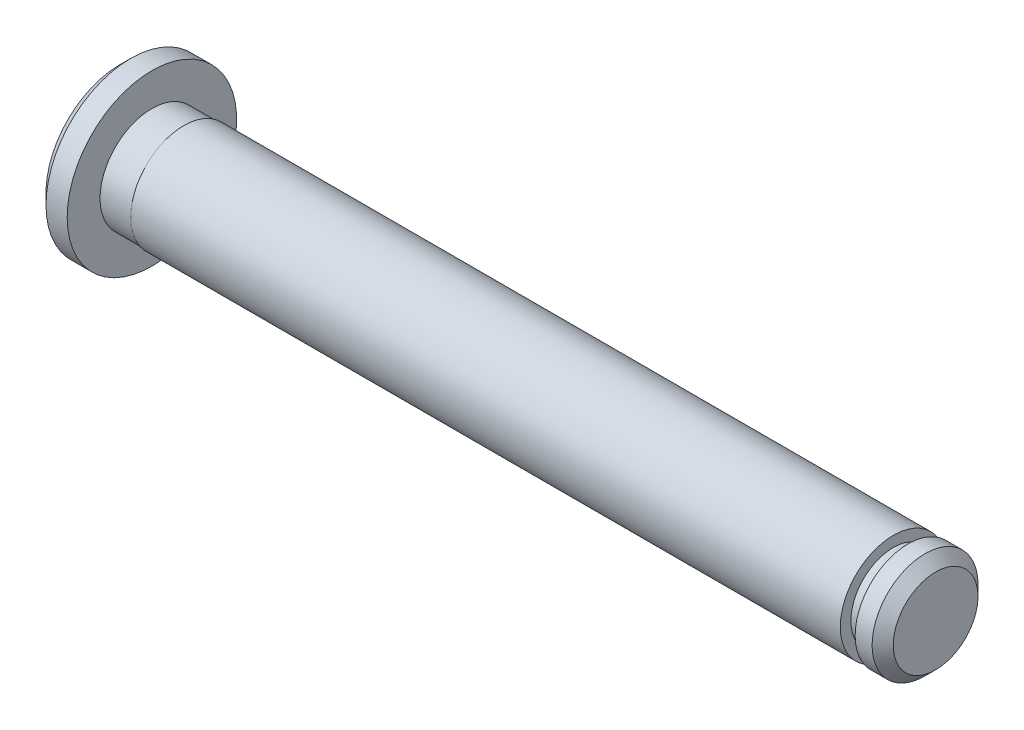
ISO-10303-21;
HEADER;
FILE_DESCRIPTION(('STEP AP214'),'2;1');
FILE_NAME('part.step','',(''),(''),'','','');
FILE_SCHEMA(('AUTOMOTIVE_DESIGN { 1 0 10303 214 1 1 1 1 }'));
ENDSEC;
DATA;
#1=APPLICATION_CONTEXT('core data for automotive mechanical design processes');
#2=APPLICATION_PROTOCOL_DEFINITION('international standard','automotive_design',2000,#1);
#3=PRODUCT_CONTEXT('',#1,'mechanical');
#4=PRODUCT('Part','Part','',(#3));
#5=PRODUCT_RELATED_PRODUCT_CATEGORY('part','',(#4));
#6=PRODUCT_DEFINITION_FORMATION('','',#4);
#7=PRODUCT_DEFINITION_CONTEXT('part definition',#1,'design');
#8=PRODUCT_DEFINITION('design','',#6,#7);
#9=PRODUCT_DEFINITION_SHAPE('','',#8);
#10=(LENGTH_UNIT() NAMED_UNIT(*) SI_UNIT(.MILLI.,.METRE.));
#11=(NAMED_UNIT(*) PLANE_ANGLE_UNIT() SI_UNIT($,.RADIAN.));
#12=(NAMED_UNIT(*) SI_UNIT($,.STERADIAN.) SOLID_ANGLE_UNIT());
#13=UNCERTAINTY_MEASURE_WITH_UNIT(LENGTH_MEASURE(1.E-05),#10,'distance_accuracy_value','');
#14=(GEOMETRIC_REPRESENTATION_CONTEXT(3) GLOBAL_UNCERTAINTY_ASSIGNED_CONTEXT((#13)) GLOBAL_UNIT_ASSIGNED_CONTEXT((#10,
#11,#12)) REPRESENTATION_CONTEXT('',''));
#15=CARTESIAN_POINT('',(0.,0.,0.));
#16=DIRECTION('',(0.,0.,1.));
#17=DIRECTION('',(1.,0.,0.));
#18=AXIS2_PLACEMENT_3D('',#15,#16,#17);
#19=CARTESIAN_POINT('',(-1.5,0.,0.));
#20=DIRECTION('',(1.,0.,0.));
#21=DIRECTION('',(0.,0.,-1.));
#22=AXIS2_PLACEMENT_3D('',#19,#20,#21);
#23=PLANE('',#22);
#24=CARTESIAN_POINT('',(-1.5,0.,0.));
#25=DIRECTION('',(1.,0.,0.));
#26=DIRECTION('',(0.,0.,-1.));
#27=AXIS2_PLACEMENT_3D('',#24,#25,#26);
#28=CIRCLE('',#27,3.50000000000001);
#29=CARTESIAN_POINT('',(-1.5,0.,-3.50000000000001));
#30=VERTEX_POINT('',#29);
#31=EDGE_CURVE('E40',#30,#30,#28,.F.);
#32=ORIENTED_EDGE('',*,*,#31,.T.);
#33=EDGE_LOOP('',(#32));
#34=FACE_BOUND('',#33,.T.);
#35=ADVANCED_FACE('F33',(#34),#23,.F.);
#36=CARTESIAN_POINT('',(0.,0.,0.));
#37=DIRECTION('',(-1.,0.,0.));
#38=DIRECTION('',(0.,0.,1.));
#39=AXIS2_PLACEMENT_3D('',#36,#37,#38);
#40=CYLINDRICAL_SURFACE('',#39,4.);
#41=CARTESIAN_POINT('',(-1.,0.,0.));
#42=DIRECTION('',(1.,0.,0.));
#43=DIRECTION('',(0.,0.,-1.));
#44=AXIS2_PLACEMENT_3D('',#41,#42,#43);
#45=CIRCLE('',#44,4.);
#46=CARTESIAN_POINT('',(-1.,0.,-4.));
#47=VERTEX_POINT('',#46);
#48=EDGE_CURVE('E10',#47,#47,#45,.T.);
#49=ORIENTED_EDGE('',*,*,#48,.T.);
#50=EDGE_LOOP('',(#49));
#51=FACE_BOUND('',#50,.T.);
#52=CARTESIAN_POINT('',(0.,0.,0.));
#53=DIRECTION('',(-1.,0.,0.));
#54=DIRECTION('',(0.,0.,1.));
#55=AXIS2_PLACEMENT_3D('',#52,#53,#54);
#56=CIRCLE('',#55,4.);
#57=CARTESIAN_POINT('',(0.,0.,4.));
#58=VERTEX_POINT('',#57);
#59=EDGE_CURVE('E53',#58,#58,#56,.T.);
#60=ORIENTED_EDGE('',*,*,#59,.T.);
#61=EDGE_LOOP('',(#60));
#62=FACE_BOUND('',#61,.T.);
#63=ADVANCED_FACE('F96',(#51,#62),#40,.T.);
#64=CARTESIAN_POINT('',(0.,4.,0.));
#65=DIRECTION('',(-1.,0.,0.));
#66=DIRECTION('',(0.,0.,1.));
#67=AXIS2_PLACEMENT_3D('',#64,#65,#66);
#68=PLANE('',#67);
#69=ORIENTED_EDGE('',*,*,#59,.F.);
#70=EDGE_LOOP('',(#69));
#71=FACE_BOUND('',#70,.T.);
#72=CARTESIAN_POINT('',(0.,0.,0.));
#73=DIRECTION('',(-1.,0.,0.));
#74=DIRECTION('',(0.,0.,1.));
#75=AXIS2_PLACEMENT_3D('',#72,#73,#74);
#76=CIRCLE('',#75,2.45);
#77=CARTESIAN_POINT('',(0.,0.,2.45));
#78=VERTEX_POINT('',#77);
#79=EDGE_CURVE('E56',#78,#78,#76,.T.);
#80=ORIENTED_EDGE('',*,*,#79,.T.);
#81=EDGE_LOOP('',(#80));
#82=FACE_BOUND('',#81,.T.);
#83=ADVANCED_FACE('F101',(#71,#82),#68,.F.);
#84=CARTESIAN_POINT('',(0.,0.,0.));
#85=DIRECTION('',(-1.,0.,0.));
#86=DIRECTION('',(0.,0.,1.));
#87=AXIS2_PLACEMENT_3D('',#84,#85,#86);
#88=CYLINDRICAL_SURFACE('',#87,2.45);
#89=ORIENTED_EDGE('',*,*,#79,.F.);
#90=EDGE_LOOP('',(#89));
#91=FACE_BOUND('',#90,.T.);
#92=CARTESIAN_POINT('',(1.5,0.,0.));
#93=DIRECTION('',(-1.,0.,0.));
#94=DIRECTION('',(0.,0.,1.));
#95=AXIS2_PLACEMENT_3D('',#92,#93,#94);
#96=CIRCLE('',#95,2.45);
#97=CARTESIAN_POINT('',(1.5,0.,2.45));
#98=VERTEX_POINT('',#97);
#99=EDGE_CURVE('E59',#98,#98,#96,.T.);
#100=ORIENTED_EDGE('',*,*,#99,.T.);
#101=EDGE_LOOP('',(#100));
#102=FACE_BOUND('',#101,.T.);
#103=ADVANCED_FACE('F187',(#91,#102),#88,.T.);
#104=CARTESIAN_POINT('',(1.5,2.45,0.));
#105=DIRECTION('',(1.,0.,0.));
#106=DIRECTION('',(0.,0.,-1.));
#107=AXIS2_PLACEMENT_3D('',#104,#105,#106);
#108=PLANE('',#107);
#109=ORIENTED_EDGE('',*,*,#99,.F.);
#110=EDGE_LOOP('',(#109));
#111=FACE_BOUND('',#110,.T.);
#112=CARTESIAN_POINT('',(1.5,0.,0.));
#113=DIRECTION('',(-1.,0.,0.));
#114=DIRECTION('',(0.,0.,1.));
#115=AXIS2_PLACEMENT_3D('',#112,#113,#114);
#116=CIRCLE('',#115,2.5);
#117=CARTESIAN_POINT('',(1.5,0.,2.5));
#118=VERTEX_POINT('',#117);
#119=EDGE_CURVE('E62',#118,#118,#116,.T.);
#120=ORIENTED_EDGE('',*,*,#119,.T.);
#121=EDGE_LOOP('',(#120));
#122=FACE_BOUND('',#121,.T.);
#123=ADVANCED_FACE('F177',(#111,#122),#108,.F.);
#124=CARTESIAN_POINT('',(0.,0.,0.));
#125=DIRECTION('',(-1.,0.,0.));
#126=DIRECTION('',(0.,0.,1.));
#127=AXIS2_PLACEMENT_3D('',#124,#125,#126);
#128=CYLINDRICAL_SURFACE('',#127,2.5);
#129=ORIENTED_EDGE('',*,*,#119,.F.);
#130=EDGE_LOOP('',(#129));
#131=FACE_BOUND('',#130,.T.);
#132=CARTESIAN_POINT('',(35.,0.,0.));
#133=DIRECTION('',(-1.,0.,0.));
#134=DIRECTION('',(0.,0.,1.));
#135=AXIS2_PLACEMENT_3D('',#132,#133,#134);
#136=CIRCLE('',#135,2.5);
#137=CARTESIAN_POINT('',(35.,0.,2.5));
#138=VERTEX_POINT('',#137);
#139=EDGE_CURVE('E65',#138,#138,#136,.T.);
#140=ORIENTED_EDGE('',*,*,#139,.T.);
#141=EDGE_LOOP('',(#140));
#142=FACE_BOUND('',#141,.T.);
#143=ADVANCED_FACE('F167',(#131,#142),#128,.T.);
#144=CARTESIAN_POINT('',(35.,2.5,0.));
#145=DIRECTION('',(-1.,0.,0.));
#146=DIRECTION('',(0.,0.,1.));
#147=AXIS2_PLACEMENT_3D('',#144,#145,#146);
#148=PLANE('',#147);
#149=ORIENTED_EDGE('',*,*,#139,.F.);
#150=EDGE_LOOP('',(#149));
#151=FACE_BOUND('',#150,.T.);
#152=CARTESIAN_POINT('',(35.,0.,0.));
#153=DIRECTION('',(-1.,0.,0.));
#154=DIRECTION('',(0.,0.,1.));
#155=AXIS2_PLACEMENT_3D('',#152,#153,#154);
#156=CIRCLE('',#155,2.);
#157=CARTESIAN_POINT('',(35.,0.,2.));
#158=VERTEX_POINT('',#157);
#159=EDGE_CURVE('E68',#158,#158,#156,.T.);
#160=ORIENTED_EDGE('',*,*,#159,.T.);
#161=EDGE_LOOP('',(#160));
#162=FACE_BOUND('',#161,.T.);
#163=ADVANCED_FACE('F157',(#151,#162),#148,.F.);
#164=CARTESIAN_POINT('',(0.,0.,0.));
#165=DIRECTION('',(-1.,0.,0.));
#166=DIRECTION('',(0.,0.,1.));
#167=AXIS2_PLACEMENT_3D('',#164,#165,#166);
#168=CYLINDRICAL_SURFACE('',#167,2.);
#169=ORIENTED_EDGE('',*,*,#159,.F.);
#170=EDGE_LOOP('',(#169));
#171=FACE_BOUND('',#170,.T.);
#172=CARTESIAN_POINT('',(35.7,0.,0.));
#173=DIRECTION('',(-1.,0.,0.));
#174=DIRECTION('',(0.,0.,1.));
#175=AXIS2_PLACEMENT_3D('',#172,#173,#174);
#176=CIRCLE('',#175,2.);
#177=CARTESIAN_POINT('',(35.7,0.,2.));
#178=VERTEX_POINT('',#177);
#179=EDGE_CURVE('E71',#178,#178,#176,.T.);
#180=ORIENTED_EDGE('',*,*,#179,.T.);
#181=EDGE_LOOP('',(#180));
#182=FACE_BOUND('',#181,.T.);
#183=ADVANCED_FACE('F92',(#171,#182),#168,.T.);
#184=CARTESIAN_POINT('',(35.7,2.,0.));
#185=DIRECTION('',(1.,0.,0.));
#186=DIRECTION('',(0.,0.,-1.));
#187=AXIS2_PLACEMENT_3D('',#184,#185,#186);
#188=PLANE('',#187);
#189=ORIENTED_EDGE('',*,*,#179,.F.);
#190=EDGE_LOOP('',(#189));
#191=FACE_BOUND('',#190,.T.);
#192=CARTESIAN_POINT('',(35.7,0.,0.));
#193=DIRECTION('',(-1.,0.,0.));
#194=DIRECTION('',(0.,0.,1.));
#195=AXIS2_PLACEMENT_3D('',#192,#193,#194);
#196=CIRCLE('',#195,2.5);
#197=CARTESIAN_POINT('',(35.7,0.,2.5));
#198=VERTEX_POINT('',#197);
#199=EDGE_CURVE('E74',#198,#198,#196,.T.);
#200=ORIENTED_EDGE('',*,*,#199,.T.);
#201=EDGE_LOOP('',(#200));
#202=FACE_BOUND('',#201,.T.);
#203=ADVANCED_FACE('F78',(#191,#202),#188,.F.);
#204=CARTESIAN_POINT('',(0.,0.,0.));
#205=DIRECTION('',(-1.,0.,0.));
#206=DIRECTION('',(0.,0.,1.));
#207=AXIS2_PLACEMENT_3D('',#204,#205,#206);
#208=CYLINDRICAL_SURFACE('',#207,2.5);
#209=CARTESIAN_POINT('',(36.5,0.,0.));
#210=DIRECTION('',(-1.,0.,0.));
#211=DIRECTION('',(0.,0.,1.));
#212=AXIS2_PLACEMENT_3D('',#209,#210,#211);
#213=CIRCLE('',#212,2.5);
#214=CARTESIAN_POINT('',(36.5,0.,2.5));
#215=VERTEX_POINT('',#214);
#216=EDGE_CURVE('E48',#215,#215,#213,.T.);
#217=ORIENTED_EDGE('',*,*,#216,.T.);
#218=EDGE_LOOP('',(#217));
#219=FACE_BOUND('',#218,.T.);
#220=ORIENTED_EDGE('',*,*,#199,.F.);
#221=EDGE_LOOP('',(#220));
#222=FACE_BOUND('',#221,.T.);
#223=ADVANCED_FACE('F80',(#219,#222),#208,.T.);
#224=CARTESIAN_POINT('',(37.,2.5,0.));
#225=DIRECTION('',(-1.,0.,0.));
#226=DIRECTION('',(0.,0.,1.));
#227=AXIS2_PLACEMENT_3D('',#224,#225,#226);
#228=PLANE('',#227);
#229=CARTESIAN_POINT('',(37.,0.,0.));
#230=DIRECTION('',(-1.,0.,0.));
#231=DIRECTION('',(0.,0.,1.));
#232=AXIS2_PLACEMENT_3D('',#229,#230,#231);
#233=CIRCLE('',#232,1.99999999999999);
#234=CARTESIAN_POINT('',(37.,0.,1.99999999999999));
#235=VERTEX_POINT('',#234);
#236=EDGE_CURVE('E44',#235,#235,#233,.F.);
#237=ORIENTED_EDGE('',*,*,#236,.T.);
#238=EDGE_LOOP('',(#237));
#239=FACE_BOUND('',#238,.T.);
#240=ADVANCED_FACE('F82',(#239),#228,.F.);
#241=CARTESIAN_POINT('',(36.5,0.,0.));
#242=DIRECTION('',(-1.,0.,0.));
#243=DIRECTION('',(0.,0.,1.));
#244=AXIS2_PLACEMENT_3D('',#241,#242,#243);
#245=CONICAL_SURFACE('',#244,2.5,0.785398163397446);
#246=ORIENTED_EDGE('',*,*,#236,.F.);
#247=EDGE_LOOP('',(#246));
#248=FACE_BOUND('',#247,.T.);
#249=ORIENTED_EDGE('',*,*,#216,.F.);
#250=EDGE_LOOP('',(#249));
#251=FACE_BOUND('',#250,.T.);
#252=ADVANCED_FACE('F89',(#248,#251),#245,.T.);
#253=CARTESIAN_POINT('',(-1.5,0.,0.));
#254=DIRECTION('',(1.,0.,0.));
#255=DIRECTION('',(0.,0.,-1.));
#256=AXIS2_PLACEMENT_3D('',#253,#254,#255);
#257=CONICAL_SURFACE('',#256,3.50000000000001,0.785398163397445);
#258=ORIENTED_EDGE('',*,*,#48,.F.);
#259=EDGE_LOOP('',(#258));
#260=FACE_BOUND('',#259,.T.);
#261=ORIENTED_EDGE('',*,*,#31,.F.);
#262=EDGE_LOOP('',(#261));
#263=FACE_BOUND('',#262,.T.);
#264=ADVANCED_FACE('F35',(#260,#263),#257,.T.);
#265=CLOSED_SHELL('',(#35,#63,#83,#103,#123,#143,#163,#183,#203,#223,#240,#252,#264));
#266=MANIFOLD_SOLID_BREP('B2',#265);
#267=ADVANCED_BREP_SHAPE_REPRESENTATION('',(#18,#266),#14);
#268=SHAPE_DEFINITION_REPRESENTATION(#9,#267);
ENDSEC;
END-ISO-10303-21;
